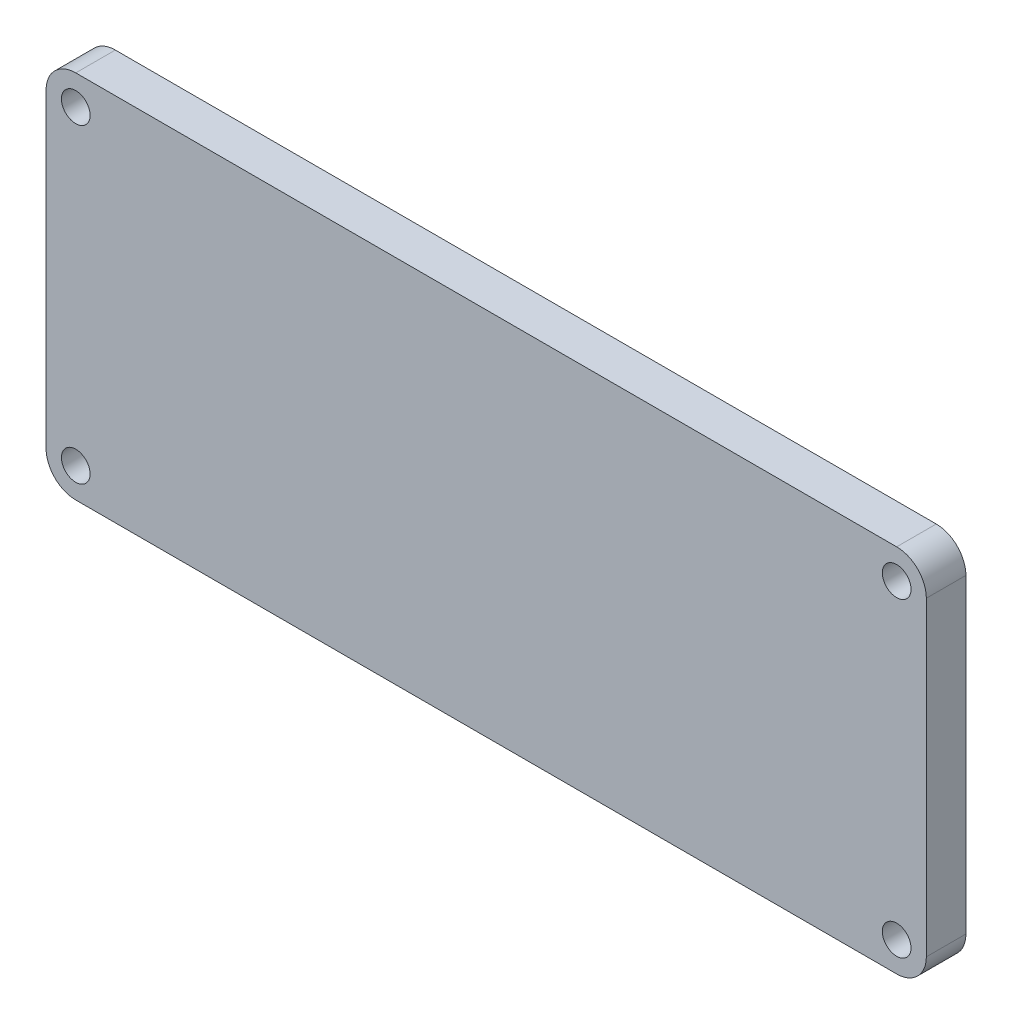
ISO-10303-21;
HEADER;
FILE_DESCRIPTION(('STEP AP214'),'2;1');
FILE_NAME('part.step','',(''),(''),'','','');
FILE_SCHEMA(('AUTOMOTIVE_DESIGN { 1 0 10303 214 1 1 1 1 }'));
ENDSEC;
DATA;
#1=APPLICATION_CONTEXT('core data for automotive mechanical design processes');
#2=APPLICATION_PROTOCOL_DEFINITION('international standard','automotive_design',2000,#1);
#3=PRODUCT_CONTEXT('',#1,'mechanical');
#4=PRODUCT('Part','Part','',(#3));
#5=PRODUCT_RELATED_PRODUCT_CATEGORY('part','',(#4));
#6=PRODUCT_DEFINITION_FORMATION('','',#4);
#7=PRODUCT_DEFINITION_CONTEXT('part definition',#1,'design');
#8=PRODUCT_DEFINITION('design','',#6,#7);
#9=PRODUCT_DEFINITION_SHAPE('','',#8);
#10=(LENGTH_UNIT() NAMED_UNIT(*) SI_UNIT(.MILLI.,.METRE.));
#11=(NAMED_UNIT(*) PLANE_ANGLE_UNIT() SI_UNIT($,.RADIAN.));
#12=(NAMED_UNIT(*) SI_UNIT($,.STERADIAN.) SOLID_ANGLE_UNIT());
#13=UNCERTAINTY_MEASURE_WITH_UNIT(LENGTH_MEASURE(1.E-05),#10,'distance_accuracy_value','');
#14=(GEOMETRIC_REPRESENTATION_CONTEXT(3) GLOBAL_UNCERTAINTY_ASSIGNED_CONTEXT((#13)) GLOBAL_UNIT_ASSIGNED_CONTEXT((#10,
#11,#12)) REPRESENTATION_CONTEXT('',''));
#15=CARTESIAN_POINT('',(0.,0.,0.));
#16=DIRECTION('',(0.,0.,1.));
#17=DIRECTION('',(1.,0.,0.));
#18=AXIS2_PLACEMENT_3D('',#15,#16,#17);
#19=CARTESIAN_POINT('',(-44.5,-18.7,4.));
#20=DIRECTION('',(-1.,0.,0.));
#21=DIRECTION('',(0.,0.,1.));
#22=AXIS2_PLACEMENT_3D('',#19,#20,#21);
#23=PLANE('',#22);
#24=DIRECTION('',(0.,1.,0.));
#25=VECTOR('',#24,1.);
#26=CARTESIAN_POINT('',(-44.5,-18.7,0.));
#27=LINE('',#26,#25);
#28=CARTESIAN_POINT('',(-44.5,-15.7,0.));
#29=VERTEX_POINT('',#28);
#30=CARTESIAN_POINT('',(-44.5,15.7,0.));
#31=VERTEX_POINT('',#30);
#32=EDGE_CURVE('E146',#29,#31,#27,.T.);
#33=ORIENTED_EDGE('',*,*,#32,.F.);
#34=DIRECTION('',(0.,0.,-1.));
#35=VECTOR('',#34,1.);
#36=CARTESIAN_POINT('',(-44.5,-15.7,4.));
#37=LINE('',#36,#35);
#38=CARTESIAN_POINT('',(-44.5,-15.7,4.));
#39=VERTEX_POINT('',#38);
#40=EDGE_CURVE('E179',#29,#39,#37,.F.);
#41=ORIENTED_EDGE('',*,*,#40,.T.);
#42=DIRECTION('',(0.,1.,0.));
#43=VECTOR('',#42,1.);
#44=CARTESIAN_POINT('',(-44.5,-18.7,4.));
#45=LINE('',#44,#43);
#46=CARTESIAN_POINT('',(-44.5,15.7,4.));
#47=VERTEX_POINT('',#46);
#48=EDGE_CURVE('E144',#39,#47,#45,.T.);
#49=ORIENTED_EDGE('',*,*,#48,.T.);
#50=DIRECTION('',(0.,0.,-1.));
#51=VECTOR('',#50,1.);
#52=CARTESIAN_POINT('',(-44.5,15.7,4.));
#53=LINE('',#52,#51);
#54=EDGE_CURVE('E175',#47,#31,#53,.T.);
#55=ORIENTED_EDGE('',*,*,#54,.T.);
#56=EDGE_LOOP('',(#33,#41,#49,#55));
#57=FACE_BOUND('',#56,.T.);
#58=ADVANCED_FACE('F41',(#57),#23,.T.);
#59=CARTESIAN_POINT('',(-44.5,-18.7,4.));
#60=DIRECTION('',(0.,1.,0.));
#61=DIRECTION('',(0.,0.,1.));
#62=AXIS2_PLACEMENT_3D('',#59,#60,#61);
#63=PLANE('',#62);
#64=DIRECTION('',(1.,0.,0.));
#65=VECTOR('',#64,1.);
#66=CARTESIAN_POINT('',(-44.5,-18.7,0.));
#67=LINE('',#66,#65);
#68=CARTESIAN_POINT('',(-41.5,-18.7,0.));
#69=VERTEX_POINT('',#68);
#70=CARTESIAN_POINT('',(41.5,-18.7,0.));
#71=VERTEX_POINT('',#70);
#72=EDGE_CURVE('E139',#69,#71,#67,.T.);
#73=ORIENTED_EDGE('',*,*,#72,.T.);
#74=DIRECTION('',(0.,0.,-1.));
#75=VECTOR('',#74,1.);
#76=CARTESIAN_POINT('',(41.5,-18.7,4.));
#77=LINE('',#76,#75);
#78=CARTESIAN_POINT('',(41.5,-18.7,4.));
#79=VERTEX_POINT('',#78);
#80=EDGE_CURVE('E115',#71,#79,#77,.F.);
#81=ORIENTED_EDGE('',*,*,#80,.T.);
#82=DIRECTION('',(1.,0.,0.));
#83=VECTOR('',#82,1.);
#84=CARTESIAN_POINT('',(-44.5,-18.7,4.));
#85=LINE('',#84,#83);
#86=CARTESIAN_POINT('',(-41.5,-18.7,4.));
#87=VERTEX_POINT('',#86);
#88=EDGE_CURVE('E151',#87,#79,#85,.T.);
#89=ORIENTED_EDGE('',*,*,#88,.F.);
#90=DIRECTION('',(0.,0.,-1.));
#91=VECTOR('',#90,1.);
#92=CARTESIAN_POINT('',(-41.5,-18.7,0.));
#93=LINE('',#92,#91);
#94=EDGE_CURVE('E121',#87,#69,#93,.T.);
#95=ORIENTED_EDGE('',*,*,#94,.T.);
#96=EDGE_LOOP('',(#73,#81,#89,#95));
#97=FACE_BOUND('',#96,.T.);
#98=ADVANCED_FACE('F237',(#97),#63,.F.);
#99=CARTESIAN_POINT('',(44.5,-18.7,4.));
#100=DIRECTION('',(-1.,0.,0.));
#101=DIRECTION('',(0.,-1.,0.));
#102=AXIS2_PLACEMENT_3D('',#99,#100,#101);
#103=PLANE('',#102);
#104=DIRECTION('',(0.,1.,0.));
#105=VECTOR('',#104,1.);
#106=CARTESIAN_POINT('',(44.5,-18.7,4.));
#107=LINE('',#106,#105);
#108=CARTESIAN_POINT('',(44.5,-15.7,4.));
#109=VERTEX_POINT('',#108);
#110=CARTESIAN_POINT('',(44.5,15.7,4.));
#111=VERTEX_POINT('',#110);
#112=EDGE_CURVE('E130',#109,#111,#107,.T.);
#113=ORIENTED_EDGE('',*,*,#112,.F.);
#114=DIRECTION('',(0.,0.,-1.));
#115=VECTOR('',#114,1.);
#116=CARTESIAN_POINT('',(44.5,-15.7,4.));
#117=LINE('',#116,#115);
#118=CARTESIAN_POINT('',(44.5,-15.7,0.));
#119=VERTEX_POINT('',#118);
#120=EDGE_CURVE('E114',#109,#119,#117,.T.);
#121=ORIENTED_EDGE('',*,*,#120,.T.);
#122=DIRECTION('',(0.,1.,0.));
#123=VECTOR('',#122,1.);
#124=CARTESIAN_POINT('',(44.5,-18.7,0.));
#125=LINE('',#124,#123);
#126=CARTESIAN_POINT('',(44.5,15.7,0.));
#127=VERTEX_POINT('',#126);
#128=EDGE_CURVE('E128',#119,#127,#125,.T.);
#129=ORIENTED_EDGE('',*,*,#128,.T.);
#130=DIRECTION('',(0.,0.,-1.));
#131=VECTOR('',#130,1.);
#132=CARTESIAN_POINT('',(44.5,15.7,4.));
#133=LINE('',#132,#131);
#134=EDGE_CURVE('E133',#127,#111,#133,.F.);
#135=ORIENTED_EDGE('',*,*,#134,.T.);
#136=EDGE_LOOP('',(#113,#121,#129,#135));
#137=FACE_BOUND('',#136,.T.);
#138=ADVANCED_FACE('F127',(#137),#103,.F.);
#139=CARTESIAN_POINT('',(-44.5,18.7,4.));
#140=DIRECTION('',(0.,1.,0.));
#141=DIRECTION('',(0.,0.,1.));
#142=AXIS2_PLACEMENT_3D('',#139,#140,#141);
#143=PLANE('',#142);
#144=DIRECTION('',(1.,0.,0.));
#145=VECTOR('',#144,1.);
#146=CARTESIAN_POINT('',(-44.5,18.7,4.));
#147=LINE('',#146,#145);
#148=CARTESIAN_POINT('',(-41.5,18.7,4.));
#149=VERTEX_POINT('',#148);
#150=CARTESIAN_POINT('',(41.5,18.7,4.));
#151=VERTEX_POINT('',#150);
#152=EDGE_CURVE('E314',#149,#151,#147,.T.);
#153=ORIENTED_EDGE('',*,*,#152,.T.);
#154=DIRECTION('',(0.,0.,-1.));
#155=VECTOR('',#154,1.);
#156=CARTESIAN_POINT('',(41.5,18.7,0.));
#157=LINE('',#156,#155);
#158=CARTESIAN_POINT('',(41.5,18.7,0.));
#159=VERTEX_POINT('',#158);
#160=EDGE_CURVE('E184',#151,#159,#157,.T.);
#161=ORIENTED_EDGE('',*,*,#160,.T.);
#162=DIRECTION('',(1.,0.,0.));
#163=VECTOR('',#162,1.);
#164=CARTESIAN_POINT('',(-44.5,18.7,0.));
#165=LINE('',#164,#163);
#166=CARTESIAN_POINT('',(-41.5,18.7,0.));
#167=VERTEX_POINT('',#166);
#168=EDGE_CURVE('E140',#167,#159,#165,.T.);
#169=ORIENTED_EDGE('',*,*,#168,.F.);
#170=DIRECTION('',(0.,0.,-1.));
#171=VECTOR('',#170,1.);
#172=CARTESIAN_POINT('',(-41.5,18.7,4.));
#173=LINE('',#172,#171);
#174=EDGE_CURVE('E65',#167,#149,#173,.F.);
#175=ORIENTED_EDGE('',*,*,#174,.T.);
#176=EDGE_LOOP('',(#153,#161,#169,#175));
#177=FACE_BOUND('',#176,.T.);
#178=ADVANCED_FACE('F248',(#177),#143,.T.);
#179=CARTESIAN_POINT('',(0.,0.,4.));
#180=DIRECTION('',(0.,0.,-1.));
#181=DIRECTION('',(-1.,0.,0.));
#182=AXIS2_PLACEMENT_3D('',#179,#180,#181);
#183=PLANE('',#182);
#184=CARTESIAN_POINT('',(-41.5,-15.7,4.));
#185=DIRECTION('',(0.,0.,1.));
#186=DIRECTION('',(-1.,0.,0.));
#187=AXIS2_PLACEMENT_3D('',#184,#185,#186);
#188=CIRCLE('',#187,1.45);
#189=CARTESIAN_POINT('',(-42.95,-15.7,4.));
#190=VERTEX_POINT('',#189);
#191=EDGE_CURVE('E309',#190,#190,#188,.T.);
#192=ORIENTED_EDGE('',*,*,#191,.F.);
#193=EDGE_LOOP('',(#192));
#194=FACE_BOUND('',#193,.T.);
#195=CARTESIAN_POINT('',(41.5,-15.7000000000001,4.));
#196=DIRECTION('',(0.,0.,1.));
#197=DIRECTION('',(1.,0.,0.));
#198=AXIS2_PLACEMENT_3D('',#195,#196,#197);
#199=CIRCLE('',#198,1.45);
#200=CARTESIAN_POINT('',(42.95,-15.7000000000001,4.));
#201=VERTEX_POINT('',#200);
#202=EDGE_CURVE('E305',#201,#201,#199,.T.);
#203=ORIENTED_EDGE('',*,*,#202,.F.);
#204=EDGE_LOOP('',(#203));
#205=FACE_BOUND('',#204,.T.);
#206=CARTESIAN_POINT('',(41.5,15.7000000000001,4.));
#207=DIRECTION('',(0.,0.,1.));
#208=DIRECTION('',(-1.,0.,0.));
#209=AXIS2_PLACEMENT_3D('',#206,#207,#208);
#210=CIRCLE('',#209,1.45);
#211=CARTESIAN_POINT('',(40.05,15.7000000000001,4.));
#212=VERTEX_POINT('',#211);
#213=EDGE_CURVE('E299',#212,#212,#210,.T.);
#214=ORIENTED_EDGE('',*,*,#213,.F.);
#215=EDGE_LOOP('',(#214));
#216=FACE_BOUND('',#215,.T.);
#217=CARTESIAN_POINT('',(-41.5,15.7,4.));
#218=DIRECTION('',(0.,0.,1.));
#219=DIRECTION('',(1.,0.,0.));
#220=AXIS2_PLACEMENT_3D('',#217,#218,#219);
#221=CIRCLE('',#220,1.45);
#222=CARTESIAN_POINT('',(-40.05,15.7,4.));
#223=VERTEX_POINT('',#222);
#224=EDGE_CURVE('E296',#223,#223,#221,.T.);
#225=ORIENTED_EDGE('',*,*,#224,.F.);
#226=EDGE_LOOP('',(#225));
#227=FACE_BOUND('',#226,.T.);
#228=ORIENTED_EDGE('',*,*,#88,.T.);
#229=CARTESIAN_POINT('',(41.5,-15.7,4.));
#230=DIRECTION('',(0.,0.,-1.));
#231=DIRECTION('',(-1.,0.,0.));
#232=AXIS2_PLACEMENT_3D('',#229,#230,#231);
#233=CIRCLE('',#232,3.);
#234=EDGE_CURVE('E172',#79,#109,#233,.F.);
#235=ORIENTED_EDGE('',*,*,#234,.T.);
#236=ORIENTED_EDGE('',*,*,#112,.T.);
#237=CARTESIAN_POINT('',(41.5,15.7,4.));
#238=DIRECTION('',(0.,0.,-1.));
#239=DIRECTION('',(-1.,0.,0.));
#240=AXIS2_PLACEMENT_3D('',#237,#238,#239);
#241=CIRCLE('',#240,3.);
#242=EDGE_CURVE('E58',#111,#151,#241,.F.);
#243=ORIENTED_EDGE('',*,*,#242,.T.);
#244=ORIENTED_EDGE('',*,*,#152,.F.);
#245=CARTESIAN_POINT('',(-41.5,15.7,4.));
#246=DIRECTION('',(0.,0.,-1.));
#247=DIRECTION('',(-1.,0.,0.));
#248=AXIS2_PLACEMENT_3D('',#245,#246,#247);
#249=CIRCLE('',#248,3.);
#250=EDGE_CURVE('E164',#149,#47,#249,.F.);
#251=ORIENTED_EDGE('',*,*,#250,.T.);
#252=ORIENTED_EDGE('',*,*,#48,.F.);
#253=CARTESIAN_POINT('',(-41.5,-15.7,4.));
#254=DIRECTION('',(0.,0.,-1.));
#255=DIRECTION('',(-1.,0.,0.));
#256=AXIS2_PLACEMENT_3D('',#253,#254,#255);
#257=CIRCLE('',#256,3.);
#258=EDGE_CURVE('E169',#39,#87,#257,.F.);
#259=ORIENTED_EDGE('',*,*,#258,.T.);
#260=EDGE_LOOP('',(#228,#235,#236,#243,#244,#251,#252,#259));
#261=FACE_BOUND('',#260,.T.);
#262=ADVANCED_FACE('F226',(#194,#205,#216,#227,#261),#183,.F.);
#263=CARTESIAN_POINT('',(0.,0.,0.));
#264=DIRECTION('',(0.,0.,-1.));
#265=DIRECTION('',(-1.,0.,0.));
#266=AXIS2_PLACEMENT_3D('',#263,#264,#265);
#267=PLANE('',#266);
#268=CARTESIAN_POINT('',(-41.5,-15.7,0.));
#269=DIRECTION('',(0.,0.,-1.));
#270=DIRECTION('',(-1.,0.,0.));
#271=AXIS2_PLACEMENT_3D('',#268,#269,#270);
#272=CIRCLE('',#271,2.95000000000002);
#273=CARTESIAN_POINT('',(-44.45,-15.7,0.));
#274=VERTEX_POINT('',#273);
#275=EDGE_CURVE('E200',#274,#274,#272,.F.);
#276=ORIENTED_EDGE('',*,*,#275,.T.);
#277=EDGE_LOOP('',(#276));
#278=FACE_BOUND('',#277,.T.);
#279=CARTESIAN_POINT('',(-41.5,15.7,0.));
#280=DIRECTION('',(0.,0.,-1.));
#281=DIRECTION('',(-1.,0.,0.));
#282=AXIS2_PLACEMENT_3D('',#279,#280,#281);
#283=CIRCLE('',#282,2.94999999999999);
#284=CARTESIAN_POINT('',(-44.45,15.7,0.));
#285=VERTEX_POINT('',#284);
#286=EDGE_CURVE('E196',#285,#285,#283,.F.);
#287=ORIENTED_EDGE('',*,*,#286,.T.);
#288=EDGE_LOOP('',(#287));
#289=FACE_BOUND('',#288,.T.);
#290=CARTESIAN_POINT('',(41.5,-15.7000000000001,0.));
#291=DIRECTION('',(0.,0.,-1.));
#292=DIRECTION('',(-1.,0.,0.));
#293=AXIS2_PLACEMENT_3D('',#290,#291,#292);
#294=CIRCLE('',#293,2.94999999999999);
#295=CARTESIAN_POINT('',(38.55,-15.7000000000001,0.));
#296=VERTEX_POINT('',#295);
#297=EDGE_CURVE('E192',#296,#296,#294,.F.);
#298=ORIENTED_EDGE('',*,*,#297,.T.);
#299=EDGE_LOOP('',(#298));
#300=FACE_BOUND('',#299,.T.);
#301=CARTESIAN_POINT('',(41.5,15.7000000000001,0.));
#302=DIRECTION('',(0.,0.,-1.));
#303=DIRECTION('',(-1.,0.,0.));
#304=AXIS2_PLACEMENT_3D('',#301,#302,#303);
#305=CIRCLE('',#304,2.94999999999999);
#306=CARTESIAN_POINT('',(38.55,15.7000000000001,0.));
#307=VERTEX_POINT('',#306);
#308=EDGE_CURVE('E188',#307,#307,#305,.F.);
#309=ORIENTED_EDGE('',*,*,#308,.T.);
#310=EDGE_LOOP('',(#309));
#311=FACE_BOUND('',#310,.T.);
#312=ORIENTED_EDGE('',*,*,#128,.F.);
#313=CARTESIAN_POINT('',(41.5,-15.7,0.));
#314=DIRECTION('',(0.,0.,-1.));
#315=DIRECTION('',(-1.,0.,0.));
#316=AXIS2_PLACEMENT_3D('',#313,#314,#315);
#317=CIRCLE('',#316,3.);
#318=EDGE_CURVE('E110',#119,#71,#317,.T.);
#319=ORIENTED_EDGE('',*,*,#318,.T.);
#320=ORIENTED_EDGE('',*,*,#72,.F.);
#321=CARTESIAN_POINT('',(-41.5,-15.7,0.));
#322=DIRECTION('',(0.,0.,-1.));
#323=DIRECTION('',(-1.,0.,0.));
#324=AXIS2_PLACEMENT_3D('',#321,#322,#323);
#325=CIRCLE('',#324,3.);
#326=EDGE_CURVE('E122',#69,#29,#325,.T.);
#327=ORIENTED_EDGE('',*,*,#326,.T.);
#328=ORIENTED_EDGE('',*,*,#32,.T.);
#329=CARTESIAN_POINT('',(-41.5,15.7,0.));
#330=DIRECTION('',(0.,0.,-1.));
#331=DIRECTION('',(-1.,0.,0.));
#332=AXIS2_PLACEMENT_3D('',#329,#330,#331);
#333=CIRCLE('',#332,3.);
#334=EDGE_CURVE('E132',#31,#167,#333,.T.);
#335=ORIENTED_EDGE('',*,*,#334,.T.);
#336=ORIENTED_EDGE('',*,*,#168,.T.);
#337=CARTESIAN_POINT('',(41.5,15.7,0.));
#338=DIRECTION('',(0.,0.,-1.));
#339=DIRECTION('',(-1.,0.,0.));
#340=AXIS2_PLACEMENT_3D('',#337,#338,#339);
#341=CIRCLE('',#340,3.);
#342=EDGE_CURVE('E137',#159,#127,#341,.T.);
#343=ORIENTED_EDGE('',*,*,#342,.T.);
#344=EDGE_LOOP('',(#312,#319,#320,#327,#328,#335,#336,#343));
#345=FACE_BOUND('',#344,.T.);
#346=ADVANCED_FACE('F135',(#278,#289,#300,#311,#345),#267,.T.);
#347=CARTESIAN_POINT('',(41.5,-15.7,4.));
#348=DIRECTION('',(0.,0.,-1.));
#349=DIRECTION('',(-1.,0.,0.));
#350=AXIS2_PLACEMENT_3D('',#347,#348,#349);
#351=CYLINDRICAL_SURFACE('',#350,3.);
#352=ORIENTED_EDGE('',*,*,#234,.F.);
#353=ORIENTED_EDGE('',*,*,#80,.F.);
#354=ORIENTED_EDGE('',*,*,#318,.F.);
#355=ORIENTED_EDGE('',*,*,#120,.F.);
#356=EDGE_LOOP('',(#352,#353,#354,#355));
#357=FACE_BOUND('',#356,.T.);
#358=ADVANCED_FACE('F113',(#357),#351,.T.);
#359=CARTESIAN_POINT('',(-41.5,-15.7,4.));
#360=DIRECTION('',(0.,0.,1.));
#361=DIRECTION('',(1.,0.,0.));
#362=AXIS2_PLACEMENT_3D('',#359,#360,#361);
#363=CYLINDRICAL_SURFACE('',#362,3.);
#364=ORIENTED_EDGE('',*,*,#258,.F.);
#365=ORIENTED_EDGE('',*,*,#40,.F.);
#366=ORIENTED_EDGE('',*,*,#326,.F.);
#367=ORIENTED_EDGE('',*,*,#94,.F.);
#368=EDGE_LOOP('',(#364,#365,#366,#367));
#369=FACE_BOUND('',#368,.T.);
#370=ADVANCED_FACE('F252',(#369),#363,.T.);
#371=CARTESIAN_POINT('',(41.5,15.7,4.));
#372=DIRECTION('',(0.,0.,1.));
#373=DIRECTION('',(1.,0.,0.));
#374=AXIS2_PLACEMENT_3D('',#371,#372,#373);
#375=CYLINDRICAL_SURFACE('',#374,3.);
#376=ORIENTED_EDGE('',*,*,#242,.F.);
#377=ORIENTED_EDGE('',*,*,#134,.F.);
#378=ORIENTED_EDGE('',*,*,#342,.F.);
#379=ORIENTED_EDGE('',*,*,#160,.F.);
#380=EDGE_LOOP('',(#376,#377,#378,#379));
#381=FACE_BOUND('',#380,.T.);
#382=ADVANCED_FACE('F255',(#381),#375,.T.);
#383=CARTESIAN_POINT('',(-41.5,15.7,4.));
#384=DIRECTION('',(0.,0.,-1.));
#385=DIRECTION('',(-1.,0.,0.));
#386=AXIS2_PLACEMENT_3D('',#383,#384,#385);
#387=CYLINDRICAL_SURFACE('',#386,3.);
#388=ORIENTED_EDGE('',*,*,#250,.F.);
#389=ORIENTED_EDGE('',*,*,#174,.F.);
#390=ORIENTED_EDGE('',*,*,#334,.F.);
#391=ORIENTED_EDGE('',*,*,#54,.F.);
#392=EDGE_LOOP('',(#388,#389,#390,#391));
#393=FACE_BOUND('',#392,.T.);
#394=ADVANCED_FACE('F259',(#393),#387,.T.);
#395=CARTESIAN_POINT('',(-41.5,15.7,4.));
#396=DIRECTION('',(0.,0.,-1.));
#397=DIRECTION('',(-1.,0.,0.));
#398=AXIS2_PLACEMENT_3D('',#395,#396,#397);
#399=CYLINDRICAL_SURFACE('',#398,1.45);
#400=CARTESIAN_POINT('',(-41.5,15.7,1.2));
#401=DIRECTION('',(0.,0.,-1.));
#402=DIRECTION('',(-1.,0.,0.));
#403=AXIS2_PLACEMENT_3D('',#400,#401,#402);
#404=CIRCLE('',#403,1.45);
#405=CARTESIAN_POINT('',(-42.95,15.7,1.2));
#406=VERTEX_POINT('',#405);
#407=EDGE_CURVE('E208',#406,#406,#404,.T.);
#408=ORIENTED_EDGE('',*,*,#407,.T.);
#409=EDGE_LOOP('',(#408));
#410=FACE_BOUND('',#409,.T.);
#411=ORIENTED_EDGE('',*,*,#224,.T.);
#412=EDGE_LOOP('',(#411));
#413=FACE_BOUND('',#412,.T.);
#414=ADVANCED_FACE('F263',(#410,#413),#399,.F.);
#415=CARTESIAN_POINT('',(41.5,15.7000000000001,4.));
#416=DIRECTION('',(0.,0.,-1.));
#417=DIRECTION('',(-1.,0.,0.));
#418=AXIS2_PLACEMENT_3D('',#415,#416,#417);
#419=CYLINDRICAL_SURFACE('',#418,1.45);
#420=CARTESIAN_POINT('',(41.5,15.7000000000001,1.2));
#421=DIRECTION('',(0.,0.,-1.));
#422=DIRECTION('',(-1.,0.,0.));
#423=AXIS2_PLACEMENT_3D('',#420,#421,#422);
#424=CIRCLE('',#423,1.45);
#425=CARTESIAN_POINT('',(40.05,15.7000000000001,1.2));
#426=VERTEX_POINT('',#425);
#427=EDGE_CURVE('E11',#426,#426,#424,.T.);
#428=ORIENTED_EDGE('',*,*,#427,.T.);
#429=EDGE_LOOP('',(#428));
#430=FACE_BOUND('',#429,.T.);
#431=ORIENTED_EDGE('',*,*,#213,.T.);
#432=EDGE_LOOP('',(#431));
#433=FACE_BOUND('',#432,.T.);
#434=ADVANCED_FACE('F292',(#430,#433),#419,.F.);
#435=CARTESIAN_POINT('',(41.5,-15.7000000000001,4.));
#436=DIRECTION('',(0.,0.,-1.));
#437=DIRECTION('',(-1.,0.,0.));
#438=AXIS2_PLACEMENT_3D('',#435,#436,#437);
#439=CYLINDRICAL_SURFACE('',#438,1.45);
#440=CARTESIAN_POINT('',(41.5,-15.7000000000001,1.2));
#441=DIRECTION('',(0.,0.,-1.));
#442=DIRECTION('',(-1.,0.,0.));
#443=AXIS2_PLACEMENT_3D('',#440,#441,#442);
#444=CIRCLE('',#443,1.45);
#445=CARTESIAN_POINT('',(40.05,-15.7000000000001,1.2));
#446=VERTEX_POINT('',#445);
#447=EDGE_CURVE('E51',#446,#446,#444,.T.);
#448=ORIENTED_EDGE('',*,*,#447,.T.);
#449=EDGE_LOOP('',(#448));
#450=FACE_BOUND('',#449,.T.);
#451=ORIENTED_EDGE('',*,*,#202,.T.);
#452=EDGE_LOOP('',(#451));
#453=FACE_BOUND('',#452,.T.);
#454=ADVANCED_FACE('F215',(#450,#453),#439,.F.);
#455=CARTESIAN_POINT('',(-41.5,-15.7,4.));
#456=DIRECTION('',(0.,0.,-1.));
#457=DIRECTION('',(-1.,0.,0.));
#458=AXIS2_PLACEMENT_3D('',#455,#456,#457);
#459=CYLINDRICAL_SURFACE('',#458,1.45);
#460=CARTESIAN_POINT('',(-41.5,-15.7,1.20000000000003));
#461=DIRECTION('',(0.,0.,-1.));
#462=DIRECTION('',(-1.,0.,0.));
#463=AXIS2_PLACEMENT_3D('',#460,#461,#462);
#464=CIRCLE('',#463,1.45);
#465=CARTESIAN_POINT('',(-42.95,-15.7,1.20000000000003));
#466=VERTEX_POINT('',#465);
#467=EDGE_CURVE('E204',#466,#466,#464,.T.);
#468=ORIENTED_EDGE('',*,*,#467,.T.);
#469=EDGE_LOOP('',(#468));
#470=FACE_BOUND('',#469,.T.);
#471=ORIENTED_EDGE('',*,*,#191,.T.);
#472=EDGE_LOOP('',(#471));
#473=FACE_BOUND('',#472,.T.);
#474=ADVANCED_FACE('F272',(#470,#473),#459,.F.);
#475=CARTESIAN_POINT('',(-41.5,-15.7,0.));
#476=DIRECTION('',(0.,0.,-1.));
#477=DIRECTION('',(-1.,0.,0.));
#478=AXIS2_PLACEMENT_3D('',#475,#476,#477);
#479=CONICAL_SURFACE('',#478,2.95000000000002,0.896055384571339);
#480=ORIENTED_EDGE('',*,*,#467,.F.);
#481=EDGE_LOOP('',(#480));
#482=FACE_BOUND('',#481,.T.);
#483=ORIENTED_EDGE('',*,*,#275,.F.);
#484=EDGE_LOOP('',(#483));
#485=FACE_BOUND('',#484,.T.);
#486=ADVANCED_FACE('F266',(#482,#485),#479,.F.);
#487=CARTESIAN_POINT('',(-41.5,15.7,0.));
#488=DIRECTION('',(0.,0.,-1.));
#489=DIRECTION('',(-1.,0.,0.));
#490=AXIS2_PLACEMENT_3D('',#487,#488,#489);
#491=CONICAL_SURFACE('',#490,2.94999999999999,0.896055384571341);
#492=ORIENTED_EDGE('',*,*,#407,.F.);
#493=EDGE_LOOP('',(#492));
#494=FACE_BOUND('',#493,.T.);
#495=ORIENTED_EDGE('',*,*,#286,.F.);
#496=EDGE_LOOP('',(#495));
#497=FACE_BOUND('',#496,.T.);
#498=ADVANCED_FACE('F221',(#494,#497),#491,.F.);
#499=CARTESIAN_POINT('',(41.5,-15.7000000000001,0.));
#500=DIRECTION('',(0.,0.,-1.));
#501=DIRECTION('',(-1.,0.,0.));
#502=AXIS2_PLACEMENT_3D('',#499,#500,#501);
#503=CONICAL_SURFACE('',#502,2.94999999999999,0.896055384571341);
#504=ORIENTED_EDGE('',*,*,#447,.F.);
#505=EDGE_LOOP('',(#504));
#506=FACE_BOUND('',#505,.T.);
#507=ORIENTED_EDGE('',*,*,#297,.F.);
#508=EDGE_LOOP('',(#507));
#509=FACE_BOUND('',#508,.T.);
#510=ADVANCED_FACE('F218',(#506,#509),#503,.F.);
#511=CARTESIAN_POINT('',(41.5,15.7000000000001,0.));
#512=DIRECTION('',(0.,0.,-1.));
#513=DIRECTION('',(-1.,0.,0.));
#514=AXIS2_PLACEMENT_3D('',#511,#512,#513);
#515=CONICAL_SURFACE('',#514,2.94999999999999,0.896055384571341);
#516=ORIENTED_EDGE('',*,*,#427,.F.);
#517=EDGE_LOOP('',(#516));
#518=FACE_BOUND('',#517,.T.);
#519=ORIENTED_EDGE('',*,*,#308,.F.);
#520=EDGE_LOOP('',(#519));
#521=FACE_BOUND('',#520,.T.);
#522=ADVANCED_FACE('F44',(#518,#521),#515,.F.);
#523=CLOSED_SHELL('',(#58,#98,#138,#178,#262,#346,#358,#370,#382,#394,#414,#434,#454,#474,#486,
#498,#510,#522));
#524=MANIFOLD_SOLID_BREP('B2',#523);
#525=ADVANCED_BREP_SHAPE_REPRESENTATION('',(#18,#524),#14);
#526=SHAPE_DEFINITION_REPRESENTATION(#9,#525);
ENDSEC;
END-ISO-10303-21;
